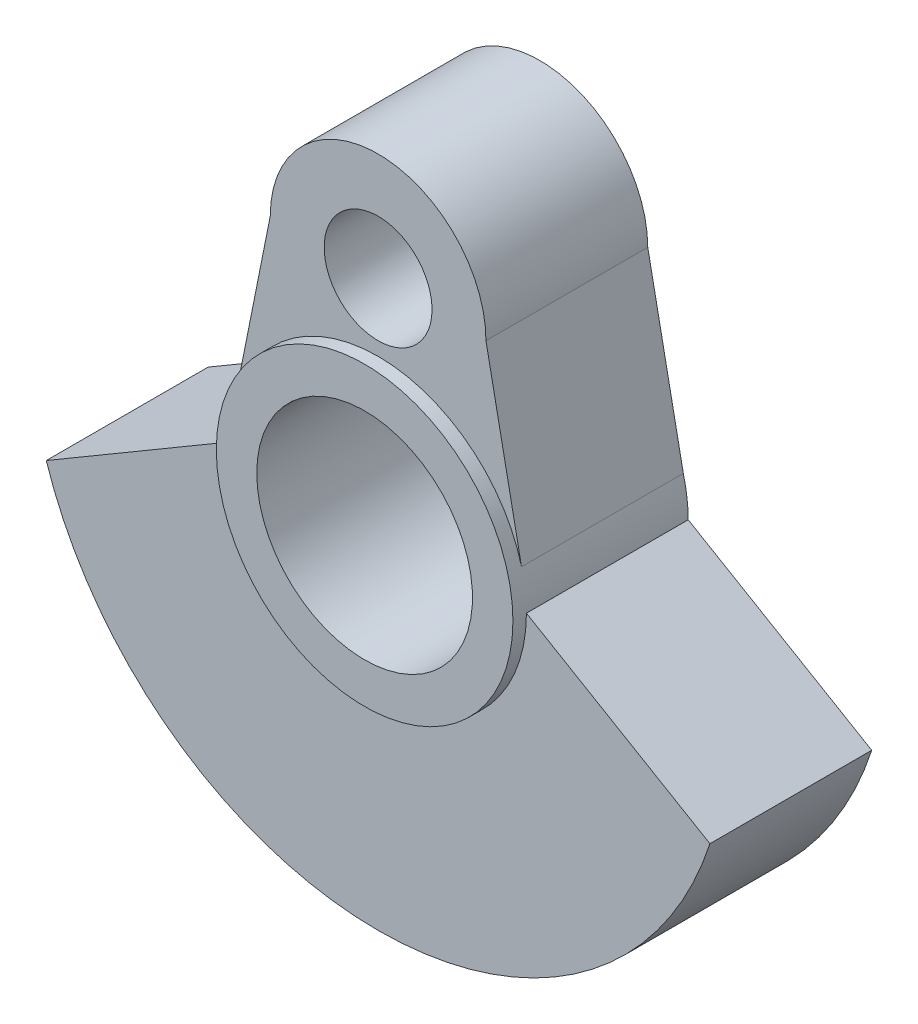
ISO-10303-21;
HEADER;
FILE_DESCRIPTION(('STEP AP214'),'2;1');
FILE_NAME('part.step','',(''),(''),'','','');
FILE_SCHEMA(('AUTOMOTIVE_DESIGN { 1 0 10303 214 1 1 1 1 }'));
ENDSEC;
DATA;
#1=APPLICATION_CONTEXT('core data for automotive mechanical design processes');
#2=APPLICATION_PROTOCOL_DEFINITION('international standard','automotive_design',2000,#1);
#3=PRODUCT_CONTEXT('',#1,'mechanical');
#4=PRODUCT('Part','Part','',(#3));
#5=PRODUCT_RELATED_PRODUCT_CATEGORY('part','',(#4));
#6=PRODUCT_DEFINITION_FORMATION('','',#4);
#7=PRODUCT_DEFINITION_CONTEXT('part definition',#1,'design');
#8=PRODUCT_DEFINITION('design','',#6,#7);
#9=PRODUCT_DEFINITION_SHAPE('','',#8);
#10=(LENGTH_UNIT() NAMED_UNIT(*) SI_UNIT(.MILLI.,.METRE.));
#11=(NAMED_UNIT(*) PLANE_ANGLE_UNIT() SI_UNIT($,.RADIAN.));
#12=(NAMED_UNIT(*) SI_UNIT($,.STERADIAN.) SOLID_ANGLE_UNIT());
#13=UNCERTAINTY_MEASURE_WITH_UNIT(LENGTH_MEASURE(1.E-05),#10,'distance_accuracy_value','');
#14=(GEOMETRIC_REPRESENTATION_CONTEXT(3) GLOBAL_UNCERTAINTY_ASSIGNED_CONTEXT((#13)) GLOBAL_UNIT_ASSIGNED_CONTEXT((#10,
#11,#12)) REPRESENTATION_CONTEXT('',''));
#15=CARTESIAN_POINT('',(0.,0.,0.));
#16=DIRECTION('',(0.,0.,1.));
#17=DIRECTION('',(1.,0.,0.));
#18=AXIS2_PLACEMENT_3D('',#15,#16,#17);
#19=CARTESIAN_POINT('',(-1.41230850380062,2.40272375877792,3.));
#20=DIRECTION('',(-0.50673796416628,0.862100130885394,0.));
#21=DIRECTION('',(-0.862100130885394,-0.50673796416628,0.));
#22=AXIS2_PLACEMENT_3D('',#19,#20,#21);
#23=PLANE('',#22);
#24=DIRECTION('',(0.862100130885394,0.50673796416628,0.));
#25=VECTOR('',#24,1.);
#26=CARTESIAN_POINT('',(-1.41230850380062,2.40272375877792,-3.));
#27=LINE('',#26,#25);
#28=CARTESIAN_POINT('',(-12.3050960602787,-4.,-3.));
#29=VERTEX_POINT('',#28);
#30=CARTESIAN_POINT('',(-5.5,0.,-3.));
#31=VERTEX_POINT('',#30);
#32=EDGE_CURVE('E179',#29,#31,#27,.T.);
#33=ORIENTED_EDGE('',*,*,#32,.F.);
#34=DIRECTION('',(0.,0.,-1.));
#35=VECTOR('',#34,1.);
#36=CARTESIAN_POINT('',(-12.3050960602787,-4.,3.));
#37=LINE('',#36,#35);
#38=CARTESIAN_POINT('',(-12.3050960602787,-4.,3.));
#39=VERTEX_POINT('',#38);
#40=EDGE_CURVE('E12',#39,#29,#37,.T.);
#41=ORIENTED_EDGE('',*,*,#40,.F.);
#42=DIRECTION('',(0.862100130885394,0.50673796416628,0.));
#43=VECTOR('',#42,1.);
#44=CARTESIAN_POINT('',(-1.41230850380062,2.40272375877792,3.));
#45=LINE('',#44,#43);
#46=CARTESIAN_POINT('',(-5.5,0.,3.));
#47=VERTEX_POINT('',#46);
#48=EDGE_CURVE('E183',#39,#47,#45,.T.);
#49=ORIENTED_EDGE('',*,*,#48,.T.);
#50=DIRECTION('',(0.,0.,-1.));
#51=VECTOR('',#50,1.);
#52=CARTESIAN_POINT('',(-5.5,0.,3.));
#53=LINE('',#52,#51);
#54=EDGE_CURVE('E198',#47,#31,#53,.T.);
#55=ORIENTED_EDGE('',*,*,#54,.T.);
#56=EDGE_LOOP('',(#33,#41,#49,#55));
#57=FACE_BOUND('',#56,.T.);
#58=ADVANCED_FACE('F49',(#57),#23,.T.);
#59=CARTESIAN_POINT('',(0.,0.,3.));
#60=DIRECTION('',(0.,0.,-1.));
#61=DIRECTION('',(-1.,0.,0.));
#62=AXIS2_PLACEMENT_3D('',#59,#60,#61);
#63=CYLINDRICAL_SURFACE('',#62,12.9389098865664);
#64=CARTESIAN_POINT('',(0.,0.,-3.));
#65=DIRECTION('',(0.,0.,1.));
#66=DIRECTION('',(1.,0.,0.));
#67=AXIS2_PLACEMENT_3D('',#64,#65,#66);
#68=CIRCLE('',#67,12.9389098865664);
#69=CARTESIAN_POINT('',(12.3050960602787,-4.,-3.));
#70=VERTEX_POINT('',#69);
#71=EDGE_CURVE('E202',#29,#70,#68,.T.);
#72=ORIENTED_EDGE('',*,*,#71,.T.);
#73=DIRECTION('',(0.,0.,-1.));
#74=VECTOR('',#73,1.);
#75=CARTESIAN_POINT('',(12.3050960602787,-4.,3.));
#76=LINE('',#75,#74);
#77=CARTESIAN_POINT('',(12.3050960602787,-4.,3.));
#78=VERTEX_POINT('',#77);
#79=EDGE_CURVE('E57',#78,#70,#76,.T.);
#80=ORIENTED_EDGE('',*,*,#79,.F.);
#81=CARTESIAN_POINT('',(0.,0.,3.));
#82=DIRECTION('',(0.,0.,1.));
#83=DIRECTION('',(1.,0.,0.));
#84=AXIS2_PLACEMENT_3D('',#81,#82,#83);
#85=CIRCLE('',#84,12.9389098865664);
#86=EDGE_CURVE('E187',#39,#78,#85,.T.);
#87=ORIENTED_EDGE('',*,*,#86,.F.);
#88=ORIENTED_EDGE('',*,*,#40,.T.);
#89=EDGE_LOOP('',(#72,#80,#87,#88));
#90=FACE_BOUND('',#89,.T.);
#91=ADVANCED_FACE('F235',(#90),#63,.T.);
#92=CARTESIAN_POINT('',(1.41230850380062,2.40272375877792,3.));
#93=DIRECTION('',(-0.50673796416628,-0.862100130885394,0.));
#94=DIRECTION('',(0.862100130885394,-0.50673796416628,0.));
#95=AXIS2_PLACEMENT_3D('',#92,#93,#94);
#96=PLANE('',#95);
#97=DIRECTION('',(-0.862100130885394,0.50673796416628,0.));
#98=VECTOR('',#97,1.);
#99=CARTESIAN_POINT('',(1.41230850380062,2.40272375877792,-3.));
#100=LINE('',#99,#98);
#101=CARTESIAN_POINT('',(5.5,0.,-3.));
#102=VERTEX_POINT('',#101);
#103=EDGE_CURVE('E188',#70,#102,#100,.T.);
#104=ORIENTED_EDGE('',*,*,#103,.T.);
#105=DIRECTION('',(0.,0.,-1.));
#106=VECTOR('',#105,1.);
#107=CARTESIAN_POINT('',(5.5,0.,3.));
#108=LINE('',#107,#106);
#109=CARTESIAN_POINT('',(5.5,0.,3.));
#110=VERTEX_POINT('',#109);
#111=EDGE_CURVE('E211',#110,#102,#108,.T.);
#112=ORIENTED_EDGE('',*,*,#111,.F.);
#113=DIRECTION('',(-0.862100130885394,0.50673796416628,0.));
#114=VECTOR('',#113,1.);
#115=CARTESIAN_POINT('',(1.41230850380062,2.40272375877792,3.));
#116=LINE('',#115,#114);
#117=EDGE_CURVE('E191',#78,#110,#116,.T.);
#118=ORIENTED_EDGE('',*,*,#117,.F.);
#119=ORIENTED_EDGE('',*,*,#79,.T.);
#120=EDGE_LOOP('',(#104,#112,#118,#119));
#121=FACE_BOUND('',#120,.T.);
#122=ADVANCED_FACE('F220',(#121),#96,.F.);
#123=CARTESIAN_POINT('',(0.,0.,3.));
#124=DIRECTION('',(0.,0.,1.));
#125=DIRECTION('',(1.,0.,0.));
#126=AXIS2_PLACEMENT_3D('',#123,#124,#125);
#127=PLANE('',#126);
#128=ORIENTED_EDGE('',*,*,#48,.F.);
#129=ORIENTED_EDGE('',*,*,#86,.T.);
#130=ORIENTED_EDGE('',*,*,#117,.T.);
#131=CARTESIAN_POINT('',(0.,0.,3.));
#132=DIRECTION('',(0.,0.,1.));
#133=DIRECTION('',(1.,0.,0.));
#134=AXIS2_PLACEMENT_3D('',#131,#132,#133);
#135=CIRCLE('',#134,5.5);
#136=EDGE_CURVE('E195',#47,#110,#135,.T.);
#137=ORIENTED_EDGE('',*,*,#136,.F.);
#138=EDGE_LOOP('',(#128,#129,#130,#137));
#139=FACE_BOUND('',#138,.T.);
#140=ADVANCED_FACE('F234',(#139),#127,.T.);
#141=CARTESIAN_POINT('',(0.,0.,-3.));
#142=DIRECTION('',(0.,0.,1.));
#143=DIRECTION('',(1.,0.,0.));
#144=AXIS2_PLACEMENT_3D('',#141,#142,#143);
#145=PLANE('',#144);
#146=ORIENTED_EDGE('',*,*,#32,.T.);
#147=CARTESIAN_POINT('',(0.,0.,-3.));
#148=DIRECTION('',(0.,0.,1.));
#149=DIRECTION('',(1.,0.,0.));
#150=AXIS2_PLACEMENT_3D('',#147,#148,#149);
#151=CIRCLE('',#150,5.5);
#152=CARTESIAN_POINT('',(-5.31926196904864,1.39837480835176,-3.));
#153=VERTEX_POINT('',#152);
#154=EDGE_CURVE('E171',#153,#31,#151,.T.);
#155=ORIENTED_EDGE('',*,*,#154,.F.);
#156=DIRECTION('',(-0.19596429700171,-0.980611031092668,0.));
#157=VECTOR('',#156,1.);
#158=CARTESIAN_POINT('',(-5.38370998792408,1.07587505095578,-3.));
#159=LINE('',#158,#157);
#160=CARTESIAN_POINT('',(-4.,8.,-3.));
#161=VERTEX_POINT('',#160);
#162=EDGE_CURVE('E141',#161,#153,#159,.T.);
#163=ORIENTED_EDGE('',*,*,#162,.F.);
#164=CARTESIAN_POINT('',(0.,8.,-3.));
#165=DIRECTION('',(0.,0.,1.));
#166=DIRECTION('',(1.,0.,0.));
#167=AXIS2_PLACEMENT_3D('',#164,#165,#166);
#168=CIRCLE('',#167,4.);
#169=CARTESIAN_POINT('',(4.,8.,-3.));
#170=VERTEX_POINT('',#169);
#171=EDGE_CURVE('E154',#170,#161,#168,.T.);
#172=ORIENTED_EDGE('',*,*,#171,.F.);
#173=DIRECTION('',(0.19596429700171,-0.980611031092668,0.));
#174=VECTOR('',#173,1.);
#175=CARTESIAN_POINT('',(5.38370998792408,1.07587505095578,-3.));
#176=LINE('',#175,#174);
#177=CARTESIAN_POINT('',(5.31926196904864,1.39837480835177,-3.));
#178=VERTEX_POINT('',#177);
#179=EDGE_CURVE('E118',#170,#178,#176,.T.);
#180=ORIENTED_EDGE('',*,*,#179,.T.);
#181=EDGE_CURVE('E180',#102,#178,#151,.T.);
#182=ORIENTED_EDGE('',*,*,#181,.F.);
#183=ORIENTED_EDGE('',*,*,#103,.F.);
#184=ORIENTED_EDGE('',*,*,#71,.F.);
#185=EDGE_LOOP('',(#146,#155,#163,#172,#180,#182,#183,#184));
#186=FACE_BOUND('',#185,.T.);
#187=CARTESIAN_POINT('',(0.,0.,-3.));
#188=DIRECTION('',(0.,0.,1.));
#189=DIRECTION('',(1.,0.,0.));
#190=AXIS2_PLACEMENT_3D('',#187,#188,#189);
#191=CIRCLE('',#190,4.);
#192=CARTESIAN_POINT('',(-4.,0.,-3.));
#193=VERTEX_POINT('',#192);
#194=EDGE_CURVE('E123',#193,#193,#191,.T.);
#195=ORIENTED_EDGE('',*,*,#194,.T.);
#196=EDGE_LOOP('',(#195));
#197=FACE_BOUND('',#196,.T.);
#198=CARTESIAN_POINT('',(0.,8.,-3.));
#199=DIRECTION('',(0.,0.,1.));
#200=DIRECTION('',(1.,0.,0.));
#201=AXIS2_PLACEMENT_3D('',#198,#199,#200);
#202=CIRCLE('',#201,2.);
#203=CARTESIAN_POINT('',(2.,8.,-3.));
#204=VERTEX_POINT('',#203);
#205=EDGE_CURVE('E148',#204,#204,#202,.T.);
#206=ORIENTED_EDGE('',*,*,#205,.T.);
#207=EDGE_LOOP('',(#206));
#208=FACE_BOUND('',#207,.T.);
#209=ADVANCED_FACE('F226',(#186,#197,#208),#145,.F.);
#210=CARTESIAN_POINT('',(0.,0.,3.5));
#211=DIRECTION('',(0.,0.,1.));
#212=DIRECTION('',(1.,0.,0.));
#213=AXIS2_PLACEMENT_3D('',#210,#211,#212);
#214=PLANE('',#213);
#215=CARTESIAN_POINT('',(0.,0.,3.5));
#216=DIRECTION('',(0.,0.,1.));
#217=DIRECTION('',(1.,0.,0.));
#218=AXIS2_PLACEMENT_3D('',#215,#216,#217);
#219=CIRCLE('',#218,5.5);
#220=CARTESIAN_POINT('',(5.5,0.,3.5));
#221=VERTEX_POINT('',#220);
#222=EDGE_CURVE('E175',#221,#221,#219,.T.);
#223=ORIENTED_EDGE('',*,*,#222,.T.);
#224=EDGE_LOOP('',(#223));
#225=FACE_BOUND('',#224,.T.);
#226=CARTESIAN_POINT('',(0.,0.,3.5));
#227=DIRECTION('',(0.,0.,1.));
#228=DIRECTION('',(1.,0.,0.));
#229=AXIS2_PLACEMENT_3D('',#226,#227,#228);
#230=CIRCLE('',#229,4.);
#231=CARTESIAN_POINT('',(-4.,0.,3.5));
#232=VERTEX_POINT('',#231);
#233=EDGE_CURVE('E167',#232,#232,#230,.T.);
#234=ORIENTED_EDGE('',*,*,#233,.F.);
#235=EDGE_LOOP('',(#234));
#236=FACE_BOUND('',#235,.T.);
#237=ADVANCED_FACE('F263',(#225,#236),#214,.T.);
#238=CARTESIAN_POINT('',(0.,0.,3.5));
#239=DIRECTION('',(0.,0.,-1.));
#240=DIRECTION('',(-1.,0.,0.));
#241=AXIS2_PLACEMENT_3D('',#238,#239,#240);
#242=CYLINDRICAL_SURFACE('',#241,5.5);
#243=ORIENTED_EDGE('',*,*,#181,.T.);
#244=DIRECTION('',(0.,0.,-1.));
#245=VECTOR('',#244,1.);
#246=CARTESIAN_POINT('',(5.31926196904864,1.39837480835176,3.));
#247=LINE('',#246,#245);
#248=CARTESIAN_POINT('',(5.31926196904864,1.39837480835177,3.));
#249=VERTEX_POINT('',#248);
#250=EDGE_CURVE('E69',#249,#178,#247,.T.);
#251=ORIENTED_EDGE('',*,*,#250,.F.);
#252=CARTESIAN_POINT('',(0.,0.,3.));
#253=DIRECTION('',(0.,0.,1.));
#254=DIRECTION('',(1.,0.,0.));
#255=AXIS2_PLACEMENT_3D('',#252,#253,#254);
#256=CIRCLE('',#255,5.5);
#257=CARTESIAN_POINT('',(-5.31926196904864,1.39837480835177,3.));
#258=VERTEX_POINT('',#257);
#259=EDGE_CURVE('E64',#249,#258,#256,.T.);
#260=ORIENTED_EDGE('',*,*,#259,.T.);
#261=DIRECTION('',(0.,0.,-1.));
#262=VECTOR('',#261,1.);
#263=CARTESIAN_POINT('',(-5.31926196904864,1.39837480835176,3.));
#264=LINE('',#263,#262);
#265=EDGE_CURVE('E162',#258,#153,#264,.T.);
#266=ORIENTED_EDGE('',*,*,#265,.T.);
#267=ORIENTED_EDGE('',*,*,#154,.T.);
#268=ORIENTED_EDGE('',*,*,#54,.F.);
#269=ORIENTED_EDGE('',*,*,#136,.T.);
#270=ORIENTED_EDGE('',*,*,#111,.T.);
#271=EDGE_LOOP('',(#243,#251,#260,#266,#267,#268,#269,#270));
#272=FACE_BOUND('',#271,.T.);
#273=ORIENTED_EDGE('',*,*,#222,.F.);
#274=EDGE_LOOP('',(#273));
#275=FACE_BOUND('',#274,.T.);
#276=ADVANCED_FACE('F229',(#272,#275),#242,.T.);
#277=CARTESIAN_POINT('',(0.,0.,3.5));
#278=DIRECTION('',(0.,0.,-1.));
#279=DIRECTION('',(-1.,0.,0.));
#280=AXIS2_PLACEMENT_3D('',#277,#278,#279);
#281=CYLINDRICAL_SURFACE('',#280,4.);
#282=CARTESIAN_POINT('',(-4.,0.,3.5));
#283=CARTESIAN_POINT('',(-4.,0.,3.43229166666667));
#284=CARTESIAN_POINT('',(-4.,0.,3.36458333333333));
#285=CARTESIAN_POINT('',(-4.,0.,3.22916666666667));
#286=CARTESIAN_POINT('',(-4.,0.,3.16145833333333));
#287=CARTESIAN_POINT('',(-4.,0.,3.02604166666667));
#288=CARTESIAN_POINT('',(-4.,0.,2.95833333333333));
#289=CARTESIAN_POINT('',(-4.,0.,2.82291666666667));
#290=CARTESIAN_POINT('',(-4.,0.,2.75520833333333));
#291=CARTESIAN_POINT('',(-4.,0.,2.61979166666667));
#292=CARTESIAN_POINT('',(-4.,0.,2.55208333333333));
#293=CARTESIAN_POINT('',(-4.,0.,2.41666666666667));
#294=CARTESIAN_POINT('',(-4.,0.,2.34895833333333));
#295=CARTESIAN_POINT('',(-4.,0.,2.21354166666667));
#296=CARTESIAN_POINT('',(-4.,0.,2.14583333333333));
#297=CARTESIAN_POINT('',(-4.,0.,2.01041666666667));
#298=CARTESIAN_POINT('',(-4.,0.,1.94270833333333));
#299=CARTESIAN_POINT('',(-4.,0.,1.80729166666667));
#300=CARTESIAN_POINT('',(-4.,0.,1.73958333333333));
#301=CARTESIAN_POINT('',(-4.,0.,1.60416666666667));
#302=CARTESIAN_POINT('',(-4.,0.,1.53645833333333));
#303=CARTESIAN_POINT('',(-4.,0.,1.40104166666667));
#304=CARTESIAN_POINT('',(-4.,0.,1.33333333333333));
#305=CARTESIAN_POINT('',(-4.,0.,1.19791666666667));
#306=CARTESIAN_POINT('',(-4.,0.,1.13020833333333));
#307=CARTESIAN_POINT('',(-4.,0.,0.994791666666666));
#308=CARTESIAN_POINT('',(-4.,0.,0.927083333333333));
#309=CARTESIAN_POINT('',(-4.,0.,0.791666666666666));
#310=CARTESIAN_POINT('',(-4.,0.,0.723958333333333));
#311=CARTESIAN_POINT('',(-4.,0.,0.588541666666666));
#312=CARTESIAN_POINT('',(-4.,0.,0.520833333333333));
#313=CARTESIAN_POINT('',(-4.,0.,0.385416666666666));
#314=CARTESIAN_POINT('',(-4.,0.,0.317708333333333));
#315=CARTESIAN_POINT('',(-4.,0.,0.182291666666666));
#316=CARTESIAN_POINT('',(-4.,0.,0.114583333333333));
#317=CARTESIAN_POINT('',(-4.,0.,-0.0208333333333341));
#318=CARTESIAN_POINT('',(-4.,0.,-0.0885416666666673));
#319=CARTESIAN_POINT('',(-4.,0.,-0.223958333333334));
#320=CARTESIAN_POINT('',(-4.,0.,-0.291666666666667));
#321=CARTESIAN_POINT('',(-4.,0.,-0.427083333333334));
#322=CARTESIAN_POINT('',(-4.,0.,-0.494791666666667));
#323=CARTESIAN_POINT('',(-4.,0.,-0.630208333333333));
#324=CARTESIAN_POINT('',(-4.,0.,-0.697916666666666));
#325=CARTESIAN_POINT('',(-4.,0.,-0.833333333333333));
#326=CARTESIAN_POINT('',(-4.,0.,-0.901041666666667));
#327=CARTESIAN_POINT('',(-4.,0.,-1.03645833333333));
#328=CARTESIAN_POINT('',(-4.,0.,-1.10416666666667));
#329=CARTESIAN_POINT('',(-4.,0.,-1.23958333333333));
#330=CARTESIAN_POINT('',(-4.,0.,-1.30729166666667));
#331=CARTESIAN_POINT('',(-4.,0.,-1.44270833333333));
#332=CARTESIAN_POINT('',(-4.,0.,-1.51041666666667));
#333=CARTESIAN_POINT('',(-4.,0.,-1.64583333333333));
#334=CARTESIAN_POINT('',(-4.,0.,-1.71354166666667));
#335=CARTESIAN_POINT('',(-4.,0.,-1.84895833333333));
#336=CARTESIAN_POINT('',(-4.,0.,-1.91666666666667));
#337=CARTESIAN_POINT('',(-4.,0.,-2.05208333333333));
#338=CARTESIAN_POINT('',(-4.,0.,-2.11979166666667));
#339=CARTESIAN_POINT('',(-4.,0.,-2.25520833333333));
#340=CARTESIAN_POINT('',(-4.,0.,-2.32291666666667));
#341=CARTESIAN_POINT('',(-4.,0.,-2.45833333333333));
#342=CARTESIAN_POINT('',(-4.,0.,-2.52604166666667));
#343=CARTESIAN_POINT('',(-4.,0.,-2.66145833333333));
#344=CARTESIAN_POINT('',(-4.,0.,-2.72916666666667));
#345=CARTESIAN_POINT('',(-4.,0.,-2.86458333333333));
#346=CARTESIAN_POINT('',(-4.,0.,-2.93229166666667));
#347=CARTESIAN_POINT('',(-4.,0.,-3.));
#348=B_SPLINE_CURVE_WITH_KNOTS('',3,(#282,#283,#284,#285,#286,#287,#288,#289,#290,#291,#292,
#293,#294,#295,#296,#297,#298,#299,#300,#301,#302,#303,#304,#305,#306,#307,#308,#309,#310,#311,
#312,#313,#314,#315,#316,#317,#318,#319,#320,#321,#322,#323,#324,#325,#326,#327,#328,#329,#330,
#331,#332,#333,#334,#335,#336,#337,#338,#339,#340,#341,#342,#343,#344,#345,#346,#347),
.UNSPECIFIED.,.F.,.F.,(4,2,2,2,2,2,2,2,2,2,2,2,2,2,2,2,2,2,2,2,2,2,2,2,2,2,2,2,2,2,2,2,4),(0.,
0.203125,0.40625,0.609375,0.8125,1.015625,1.21875,1.421875,1.625,1.828125,2.03125,2.234375,
2.4375,2.640625,2.84375,3.046875,3.25,3.453125,3.65625,3.859375,4.0625,4.265625,4.46875,
4.671875,4.875,5.078125,5.28125,5.484375,5.6875,5.890625,6.09375,6.296875,6.5),.UNSPECIFIED.);
#349=EDGE_CURVE('BSEAM268',#232,#193,#348,.T.);
#350=ORIENTED_EDGE('',*,*,#233,.T.);
#351=ORIENTED_EDGE('',*,*,#194,.F.);
#352=ORIENTED_EDGE('',*,*,#349,.T.);
#353=ORIENTED_EDGE('',*,*,#349,.F.);
#354=EDGE_LOOP('',(#350,#352,#351,#353));
#355=FACE_BOUND('',#354,.T.);
#356=ADVANCED_FACE('F268',(#355),#281,.F.);
#357=CARTESIAN_POINT('',(5.38370998792408,1.07587505095578,3.));
#358=DIRECTION('',(0.980611031092668,0.19596429700171,0.));
#359=DIRECTION('',(-0.19596429700171,0.980611031092668,0.));
#360=AXIS2_PLACEMENT_3D('',#357,#358,#359);
#361=PLANE('',#360);
#362=ORIENTED_EDGE('',*,*,#179,.F.);
#363=DIRECTION('',(0.,0.,-1.));
#364=VECTOR('',#363,1.);
#365=CARTESIAN_POINT('',(4.,8.,3.));
#366=LINE('',#365,#364);
#367=CARTESIAN_POINT('',(4.,8.,3.));
#368=VERTEX_POINT('',#367);
#369=EDGE_CURVE('E112',#368,#170,#366,.T.);
#370=ORIENTED_EDGE('',*,*,#369,.F.);
#371=DIRECTION('',(0.19596429700171,-0.980611031092668,0.));
#372=VECTOR('',#371,1.);
#373=CARTESIAN_POINT('',(5.38370998792408,1.07587505095578,3.));
#374=LINE('',#373,#372);
#375=EDGE_CURVE('E116',#368,#249,#374,.T.);
#376=ORIENTED_EDGE('',*,*,#375,.T.);
#377=ORIENTED_EDGE('',*,*,#250,.T.);
#378=EDGE_LOOP('',(#362,#370,#376,#377));
#379=FACE_BOUND('',#378,.T.);
#380=ADVANCED_FACE('F114',(#379),#361,.T.);
#381=CARTESIAN_POINT('',(0.,8.,3.));
#382=DIRECTION('',(0.,0.,-1.));
#383=DIRECTION('',(-1.,0.,0.));
#384=AXIS2_PLACEMENT_3D('',#381,#382,#383);
#385=CYLINDRICAL_SURFACE('',#384,4.);
#386=ORIENTED_EDGE('',*,*,#171,.T.);
#387=DIRECTION('',(0.,0.,-1.));
#388=VECTOR('',#387,1.);
#389=CARTESIAN_POINT('',(-4.,8.,3.));
#390=LINE('',#389,#388);
#391=CARTESIAN_POINT('',(-4.,8.,3.));
#392=VERTEX_POINT('',#391);
#393=EDGE_CURVE('E124',#392,#161,#390,.T.);
#394=ORIENTED_EDGE('',*,*,#393,.F.);
#395=CARTESIAN_POINT('',(0.,8.,3.));
#396=DIRECTION('',(0.,0.,1.));
#397=DIRECTION('',(1.,0.,0.));
#398=AXIS2_PLACEMENT_3D('',#395,#396,#397);
#399=CIRCLE('',#398,4.);
#400=EDGE_CURVE('E128',#368,#392,#399,.T.);
#401=ORIENTED_EDGE('',*,*,#400,.F.);
#402=ORIENTED_EDGE('',*,*,#369,.T.);
#403=EDGE_LOOP('',(#386,#394,#401,#402));
#404=FACE_BOUND('',#403,.T.);
#405=ADVANCED_FACE('F129',(#404),#385,.T.);
#406=CARTESIAN_POINT('',(-5.38370998792408,1.07587505095578,3.));
#407=DIRECTION('',(0.980611031092668,-0.19596429700171,0.));
#408=DIRECTION('',(0.19596429700171,0.980611031092668,0.));
#409=AXIS2_PLACEMENT_3D('',#406,#407,#408);
#410=PLANE('',#409);
#411=ORIENTED_EDGE('',*,*,#162,.T.);
#412=ORIENTED_EDGE('',*,*,#265,.F.);
#413=DIRECTION('',(-0.19596429700171,-0.980611031092668,0.));
#414=VECTOR('',#413,1.);
#415=CARTESIAN_POINT('',(-5.38370998792408,1.07587505095578,3.));
#416=LINE('',#415,#414);
#417=EDGE_CURVE('E133',#392,#258,#416,.T.);
#418=ORIENTED_EDGE('',*,*,#417,.F.);
#419=ORIENTED_EDGE('',*,*,#393,.T.);
#420=EDGE_LOOP('',(#411,#412,#418,#419));
#421=FACE_BOUND('',#420,.T.);
#422=ADVANCED_FACE('F240',(#421),#410,.F.);
#423=CARTESIAN_POINT('',(0.,8.,3.));
#424=DIRECTION('',(0.,0.,-1.));
#425=DIRECTION('',(-1.,0.,0.));
#426=AXIS2_PLACEMENT_3D('',#423,#424,#425);
#427=CYLINDRICAL_SURFACE('',#426,2.);
#428=CARTESIAN_POINT('',(0.,8.,3.));
#429=DIRECTION('',(0.,0.,1.));
#430=DIRECTION('',(1.,0.,0.));
#431=AXIS2_PLACEMENT_3D('',#428,#429,#430);
#432=CIRCLE('',#431,2.);
#433=CARTESIAN_POINT('',(2.,8.,3.));
#434=VERTEX_POINT('',#433);
#435=EDGE_CURVE('E137',#434,#434,#432,.T.);
#436=ORIENTED_EDGE('',*,*,#435,.T.);
#437=EDGE_LOOP('',(#436));
#438=FACE_BOUND('',#437,.T.);
#439=ORIENTED_EDGE('',*,*,#205,.F.);
#440=EDGE_LOOP('',(#439));
#441=FACE_BOUND('',#440,.T.);
#442=ADVANCED_FACE('F242',(#438,#441),#427,.F.);
#443=CARTESIAN_POINT('',(0.,0.,3.));
#444=DIRECTION('',(0.,0.,1.));
#445=DIRECTION('',(1.,0.,0.));
#446=AXIS2_PLACEMENT_3D('',#443,#444,#445);
#447=PLANE('',#446);
#448=ORIENTED_EDGE('',*,*,#435,.F.);
#449=EDGE_LOOP('',(#448));
#450=FACE_BOUND('',#449,.T.);
#451=ORIENTED_EDGE('',*,*,#375,.F.);
#452=ORIENTED_EDGE('',*,*,#400,.T.);
#453=ORIENTED_EDGE('',*,*,#417,.T.);
#454=ORIENTED_EDGE('',*,*,#259,.F.);
#455=EDGE_LOOP('',(#451,#452,#453,#454));
#456=FACE_BOUND('',#455,.T.);
#457=ADVANCED_FACE('F135',(#450,#456),#447,.T.);
#458=CLOSED_SHELL('',(#58,#91,#122,#140,#209,#237,#276,#356,#380,#405,#422,#442,#457));
#459=MANIFOLD_SOLID_BREP('B2',#458);
#460=ADVANCED_BREP_SHAPE_REPRESENTATION('',(#18,#459),#14);
#461=SHAPE_DEFINITION_REPRESENTATION(#9,#460);
ENDSEC;
END-ISO-10303-21;
